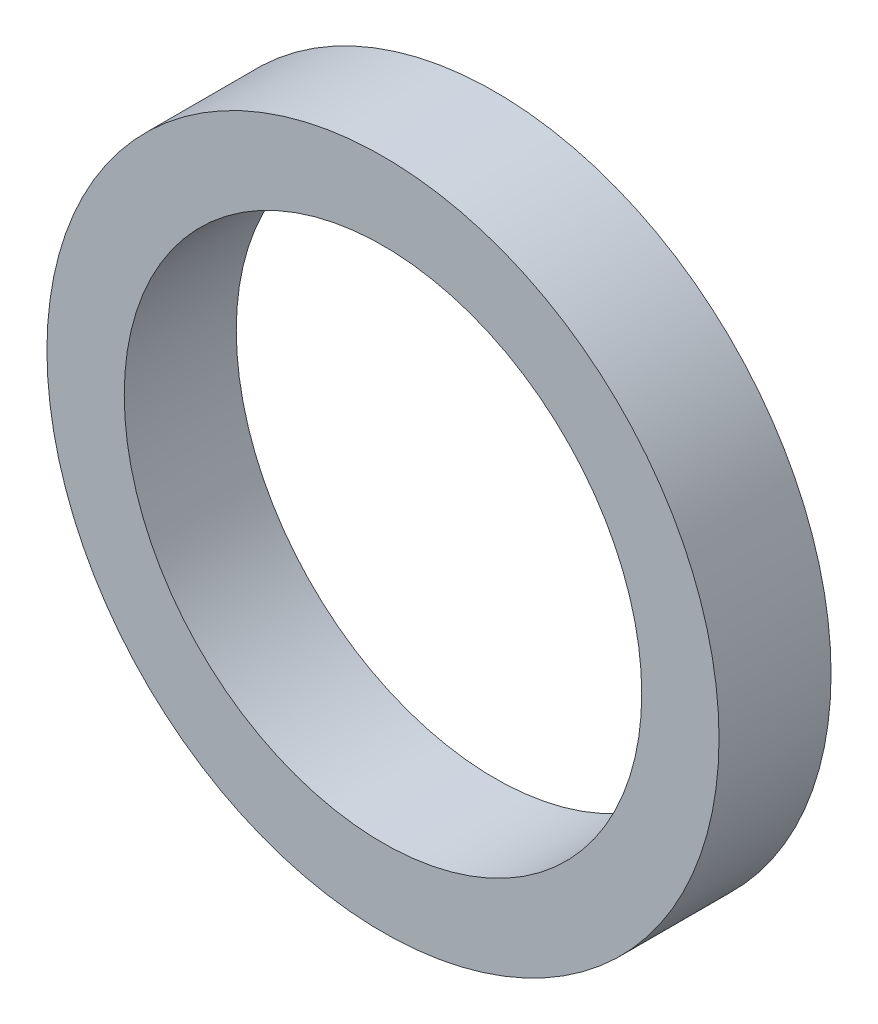
ISO-10303-21;
HEADER;
FILE_DESCRIPTION(('STEP AP214'),'2;1');
FILE_NAME('part.step','',(''),(''),'','','');
FILE_SCHEMA(('AUTOMOTIVE_DESIGN { 1 0 10303 214 1 1 1 1 }'));
ENDSEC;
DATA;
#1=APPLICATION_CONTEXT('core data for automotive mechanical design processes');
#2=APPLICATION_PROTOCOL_DEFINITION('international standard','automotive_design',2000,#1);
#3=PRODUCT_CONTEXT('',#1,'mechanical');
#4=PRODUCT('Part','Part','',(#3));
#5=PRODUCT_RELATED_PRODUCT_CATEGORY('part','',(#4));
#6=PRODUCT_DEFINITION_FORMATION('','',#4);
#7=PRODUCT_DEFINITION_CONTEXT('part definition',#1,'design');
#8=PRODUCT_DEFINITION('design','',#6,#7);
#9=PRODUCT_DEFINITION_SHAPE('','',#8);
#10=(LENGTH_UNIT() NAMED_UNIT(*) SI_UNIT(.MILLI.,.METRE.));
#11=(NAMED_UNIT(*) PLANE_ANGLE_UNIT() SI_UNIT($,.RADIAN.));
#12=(NAMED_UNIT(*) SI_UNIT($,.STERADIAN.) SOLID_ANGLE_UNIT());
#13=UNCERTAINTY_MEASURE_WITH_UNIT(LENGTH_MEASURE(1.E-05),#10,'distance_accuracy_value','');
#14=(GEOMETRIC_REPRESENTATION_CONTEXT(3) GLOBAL_UNCERTAINTY_ASSIGNED_CONTEXT((#13)) GLOBAL_UNIT_ASSIGNED_CONTEXT((#10,
#11,#12)) REPRESENTATION_CONTEXT('',''));
#15=CARTESIAN_POINT('',(0.,0.,0.));
#16=DIRECTION('',(0.,0.,1.));
#17=DIRECTION('',(1.,0.,0.));
#18=AXIS2_PLACEMENT_3D('',#15,#16,#17);
#19=CARTESIAN_POINT('',(0.,0.,10.));
#20=DIRECTION('',(0.,0.,1.));
#21=DIRECTION('',(1.,0.,0.));
#22=AXIS2_PLACEMENT_3D('',#19,#20,#21);
#23=PLANE('',#22);
#24=CARTESIAN_POINT('',(0.,0.,10.));
#25=DIRECTION('',(0.,0.,1.));
#26=DIRECTION('',(1.,0.,0.));
#27=AXIS2_PLACEMENT_3D('',#24,#25,#26);
#28=CIRCLE('',#27,30.);
#29=CARTESIAN_POINT('',(30.,0.,10.));
#30=VERTEX_POINT('',#29);
#31=EDGE_CURVE('E10',#30,#30,#28,.T.);
#32=ORIENTED_EDGE('',*,*,#31,.T.);
#33=EDGE_LOOP('',(#32));
#34=FACE_BOUND('',#33,.T.);
#35=CARTESIAN_POINT('',(0.,0.,10.));
#36=DIRECTION('',(0.,0.,1.));
#37=DIRECTION('',(1.,0.,0.));
#38=AXIS2_PLACEMENT_3D('',#35,#36,#37);
#39=CIRCLE('',#38,23.1);
#40=CARTESIAN_POINT('',(23.1,0.,10.));
#41=VERTEX_POINT('',#40);
#42=EDGE_CURVE('E45',#41,#41,#39,.T.);
#43=ORIENTED_EDGE('',*,*,#42,.F.);
#44=EDGE_LOOP('',(#43));
#45=FACE_BOUND('',#44,.T.);
#46=ADVANCED_FACE('F34',(#34,#45),#23,.T.);
#47=CARTESIAN_POINT('',(0.,0.,0.));
#48=DIRECTION('',(0.,0.,1.));
#49=DIRECTION('',(1.,0.,0.));
#50=AXIS2_PLACEMENT_3D('',#47,#48,#49);
#51=PLANE('',#50);
#52=CARTESIAN_POINT('',(0.,0.,0.));
#53=DIRECTION('',(0.,0.,1.));
#54=DIRECTION('',(1.,0.,0.));
#55=AXIS2_PLACEMENT_3D('',#52,#53,#54);
#56=CIRCLE('',#55,30.);
#57=CARTESIAN_POINT('',(30.,0.,0.));
#58=VERTEX_POINT('',#57);
#59=EDGE_CURVE('E38',#58,#58,#56,.T.);
#60=ORIENTED_EDGE('',*,*,#59,.F.);
#61=EDGE_LOOP('',(#60));
#62=FACE_BOUND('',#61,.T.);
#63=CARTESIAN_POINT('',(0.,0.,0.));
#64=DIRECTION('',(0.,0.,1.));
#65=DIRECTION('',(1.,0.,0.));
#66=AXIS2_PLACEMENT_3D('',#63,#64,#65);
#67=CIRCLE('',#66,23.1);
#68=CARTESIAN_POINT('',(23.1,0.,0.));
#69=VERTEX_POINT('',#68);
#70=EDGE_CURVE('E47',#69,#69,#67,.T.);
#71=ORIENTED_EDGE('',*,*,#70,.T.);
#72=EDGE_LOOP('',(#71));
#73=FACE_BOUND('',#72,.T.);
#74=ADVANCED_FACE('F57',(#62,#73),#51,.F.);
#75=CARTESIAN_POINT('',(0.,0.,10.));
#76=DIRECTION('',(0.,0.,-1.));
#77=DIRECTION('',(-1.,0.,0.));
#78=AXIS2_PLACEMENT_3D('',#75,#76,#77);
#79=CYLINDRICAL_SURFACE('',#78,30.);
#80=ORIENTED_EDGE('',*,*,#31,.F.);
#81=EDGE_LOOP('',(#80));
#82=FACE_BOUND('',#81,.T.);
#83=ORIENTED_EDGE('',*,*,#59,.T.);
#84=EDGE_LOOP('',(#83));
#85=FACE_BOUND('',#84,.T.);
#86=ADVANCED_FACE('F36',(#82,#85),#79,.T.);
#87=CARTESIAN_POINT('',(0.,0.,10.));
#88=DIRECTION('',(0.,0.,-1.));
#89=DIRECTION('',(-1.,0.,0.));
#90=AXIS2_PLACEMENT_3D('',#87,#88,#89);
#91=CYLINDRICAL_SURFACE('',#90,23.1);
#92=ORIENTED_EDGE('',*,*,#42,.T.);
#93=EDGE_LOOP('',(#92));
#94=FACE_BOUND('',#93,.T.);
#95=ORIENTED_EDGE('',*,*,#70,.F.);
#96=EDGE_LOOP('',(#95));
#97=FACE_BOUND('',#96,.T.);
#98=ADVANCED_FACE('F53',(#94,#97),#91,.F.);
#99=CLOSED_SHELL('',(#46,#74,#86,#98));
#100=MANIFOLD_SOLID_BREP('B2',#99);
#101=ADVANCED_BREP_SHAPE_REPRESENTATION('',(#18,#100),#14);
#102=SHAPE_DEFINITION_REPRESENTATION(#9,#101);
ENDSEC;
END-ISO-10303-21;
